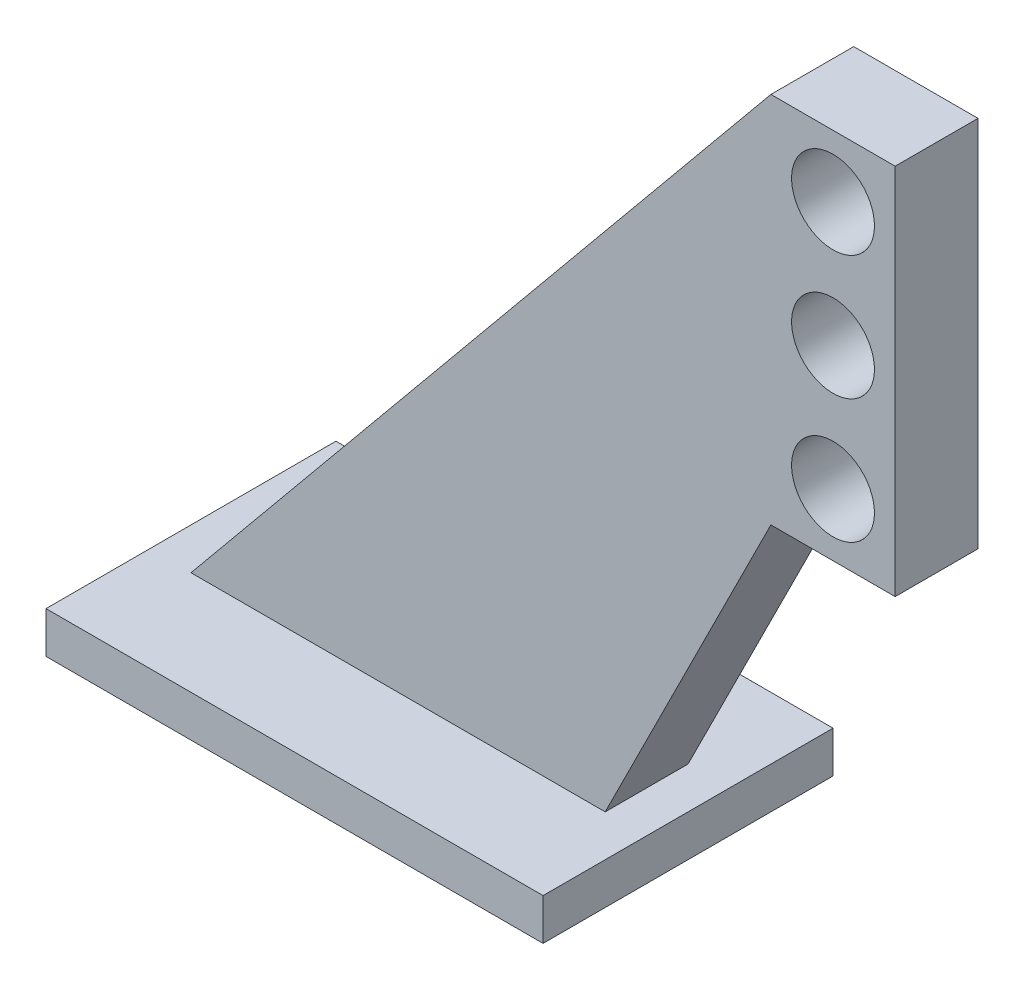
ISO-10303-21;
HEADER;
FILE_DESCRIPTION(('STEP AP214'),'2;1');
FILE_NAME('part.step','',(''),(''),'','','');
FILE_SCHEMA(('AUTOMOTIVE_DESIGN { 1 0 10303 214 1 1 1 1 }'));
ENDSEC;
DATA;
#1=APPLICATION_CONTEXT('core data for automotive mechanical design processes');
#2=APPLICATION_PROTOCOL_DEFINITION('international standard','automotive_design',2000,#1);
#3=PRODUCT_CONTEXT('',#1,'mechanical');
#4=PRODUCT('Part','Part','',(#3));
#5=PRODUCT_RELATED_PRODUCT_CATEGORY('part','',(#4));
#6=PRODUCT_DEFINITION_FORMATION('','',#4);
#7=PRODUCT_DEFINITION_CONTEXT('part definition',#1,'design');
#8=PRODUCT_DEFINITION('design','',#6,#7);
#9=PRODUCT_DEFINITION_SHAPE('','',#8);
#10=(LENGTH_UNIT() NAMED_UNIT(*) SI_UNIT(.MILLI.,.METRE.));
#11=(NAMED_UNIT(*) PLANE_ANGLE_UNIT() SI_UNIT($,.RADIAN.));
#12=(NAMED_UNIT(*) SI_UNIT($,.STERADIAN.) SOLID_ANGLE_UNIT());
#13=UNCERTAINTY_MEASURE_WITH_UNIT(LENGTH_MEASURE(1.E-05),#10,'distance_accuracy_value','');
#14=(GEOMETRIC_REPRESENTATION_CONTEXT(3) GLOBAL_UNCERTAINTY_ASSIGNED_CONTEXT((#13)) GLOBAL_UNIT_ASSIGNED_CONTEXT((#10,
#11,#12)) REPRESENTATION_CONTEXT('',''));
#15=CARTESIAN_POINT('',(0.,0.,0.));
#16=DIRECTION('',(0.,0.,1.));
#17=DIRECTION('',(1.,0.,0.));
#18=AXIS2_PLACEMENT_3D('',#15,#16,#17);
#19=CARTESIAN_POINT('',(0.,0.,2.));
#20=DIRECTION('',(0.,0.,1.));
#21=DIRECTION('',(1.,0.,0.));
#22=AXIS2_PLACEMENT_3D('',#19,#20,#21);
#23=PLANE('',#22);
#24=CARTESIAN_POINT('',(15.5,15.5,2.));
#25=DIRECTION('',(0.,0.,1.));
#26=DIRECTION('',(1.,0.,0.));
#27=AXIS2_PLACEMENT_3D('',#24,#25,#26);
#28=CIRCLE('',#27,1.);
#29=CARTESIAN_POINT('',(16.5,15.5,2.));
#30=VERTEX_POINT('',#29);
#31=EDGE_CURVE('E240',#30,#30,#28,.T.);
#32=ORIENTED_EDGE('',*,*,#31,.F.);
#33=EDGE_LOOP('',(#32));
#34=FACE_BOUND('',#33,.T.);
#35=DIRECTION('',(-0.6357072528611,-0.77193023561705,0.));
#36=VECTOR('',#35,1.);
#37=CARTESIAN_POINT('',(14.,17.,2.));
#38=LINE('',#37,#36);
#39=CARTESIAN_POINT('',(14.,17.,2.));
#40=VERTEX_POINT('',#39);
#41=CARTESIAN_POINT('',(0.,0.,2.));
#42=VERTEX_POINT('',#41);
#43=EDGE_CURVE('E84',#40,#42,#38,.T.);
#44=ORIENTED_EDGE('',*,*,#43,.T.);
#45=DIRECTION('',(1.,0.,0.));
#46=VECTOR('',#45,1.);
#47=CARTESIAN_POINT('',(0.,0.,2.));
#48=LINE('',#47,#46);
#49=CARTESIAN_POINT('',(10.,0.,2.));
#50=VERTEX_POINT('',#49);
#51=EDGE_CURVE('E144',#42,#50,#48,.T.);
#52=ORIENTED_EDGE('',*,*,#51,.T.);
#53=DIRECTION('',(0.447213595499958,0.894427190999916,0.));
#54=VECTOR('',#53,1.);
#55=CARTESIAN_POINT('',(10.,0.,2.));
#56=LINE('',#55,#54);
#57=CARTESIAN_POINT('',(14.,8.,2.));
#58=VERTEX_POINT('',#57);
#59=EDGE_CURVE('E100',#50,#58,#56,.T.);
#60=ORIENTED_EDGE('',*,*,#59,.T.);
#61=DIRECTION('',(1.,0.,0.));
#62=VECTOR('',#61,1.);
#63=CARTESIAN_POINT('',(14.,8.,2.));
#64=LINE('',#63,#62);
#65=CARTESIAN_POINT('',(17.,8.,2.));
#66=VERTEX_POINT('',#65);
#67=EDGE_CURVE('E94',#58,#66,#64,.T.);
#68=ORIENTED_EDGE('',*,*,#67,.T.);
#69=DIRECTION('',(0.,1.,0.));
#70=VECTOR('',#69,1.);
#71=CARTESIAN_POINT('',(17.,8.,2.));
#72=LINE('',#71,#70);
#73=CARTESIAN_POINT('',(17.,17.,2.));
#74=VERTEX_POINT('',#73);
#75=EDGE_CURVE('E98',#66,#74,#72,.T.);
#76=ORIENTED_EDGE('',*,*,#75,.T.);
#77=DIRECTION('',(-1.,0.,0.));
#78=VECTOR('',#77,1.);
#79=CARTESIAN_POINT('',(17.,17.,2.));
#80=LINE('',#79,#78);
#81=EDGE_CURVE('E51',#74,#40,#80,.T.);
#82=ORIENTED_EDGE('',*,*,#81,.T.);
#83=EDGE_LOOP('',(#44,#52,#60,#68,#76,#82));
#84=FACE_BOUND('',#83,.T.);
#85=CARTESIAN_POINT('',(15.5,12.5,2.));
#86=DIRECTION('',(0.,0.,1.));
#87=DIRECTION('',(1.,0.,0.));
#88=AXIS2_PLACEMENT_3D('',#85,#86,#87);
#89=CIRCLE('',#88,1.);
#90=CARTESIAN_POINT('',(16.5,12.5,2.));
#91=VERTEX_POINT('',#90);
#92=EDGE_CURVE('E122',#91,#91,#89,.T.);
#93=ORIENTED_EDGE('',*,*,#92,.F.);
#94=EDGE_LOOP('',(#93));
#95=FACE_BOUND('',#94,.T.);
#96=CARTESIAN_POINT('',(15.5,9.49999999999999,2.));
#97=DIRECTION('',(0.,0.,1.));
#98=DIRECTION('',(1.,0.,0.));
#99=AXIS2_PLACEMENT_3D('',#96,#97,#98);
#100=CIRCLE('',#99,1.);
#101=CARTESIAN_POINT('',(16.5,9.49999999999999,2.));
#102=VERTEX_POINT('',#101);
#103=EDGE_CURVE('E230',#102,#102,#100,.T.);
#104=ORIENTED_EDGE('',*,*,#103,.F.);
#105=EDGE_LOOP('',(#104));
#106=FACE_BOUND('',#105,.T.);
#107=ADVANCED_FACE('F34',(#34,#84,#95,#106),#23,.T.);
#108=CARTESIAN_POINT('',(0.,0.,0.));
#109=DIRECTION('',(0.,0.,1.));
#110=DIRECTION('',(1.,0.,0.));
#111=AXIS2_PLACEMENT_3D('',#108,#109,#110);
#112=PLANE('',#111);
#113=DIRECTION('',(-0.6357072528611,-0.77193023561705,0.));
#114=VECTOR('',#113,1.);
#115=CARTESIAN_POINT('',(14.,17.,0.));
#116=LINE('',#115,#114);
#117=CARTESIAN_POINT('',(14.,17.,0.));
#118=VERTEX_POINT('',#117);
#119=CARTESIAN_POINT('',(0.,0.,0.));
#120=VERTEX_POINT('',#119);
#121=EDGE_CURVE('E118',#118,#120,#116,.T.);
#122=ORIENTED_EDGE('',*,*,#121,.F.);
#123=DIRECTION('',(-1.,0.,0.));
#124=VECTOR('',#123,1.);
#125=CARTESIAN_POINT('',(17.,17.,0.));
#126=LINE('',#125,#124);
#127=CARTESIAN_POINT('',(17.,17.,0.));
#128=VERTEX_POINT('',#127);
#129=EDGE_CURVE('E78',#128,#118,#126,.T.);
#130=ORIENTED_EDGE('',*,*,#129,.F.);
#131=DIRECTION('',(0.,1.,0.));
#132=VECTOR('',#131,1.);
#133=CARTESIAN_POINT('',(17.,8.,0.));
#134=LINE('',#133,#132);
#135=CARTESIAN_POINT('',(17.,8.,0.));
#136=VERTEX_POINT('',#135);
#137=EDGE_CURVE('E72',#136,#128,#134,.T.);
#138=ORIENTED_EDGE('',*,*,#137,.F.);
#139=DIRECTION('',(1.,0.,0.));
#140=VECTOR('',#139,1.);
#141=CARTESIAN_POINT('',(14.,8.,0.));
#142=LINE('',#141,#140);
#143=CARTESIAN_POINT('',(14.,8.,0.));
#144=VERTEX_POINT('',#143);
#145=EDGE_CURVE('E108',#144,#136,#142,.T.);
#146=ORIENTED_EDGE('',*,*,#145,.F.);
#147=DIRECTION('',(0.447213595499958,0.894427190999916,0.));
#148=VECTOR('',#147,1.);
#149=CARTESIAN_POINT('',(10.,0.,0.));
#150=LINE('',#149,#148);
#151=CARTESIAN_POINT('',(10.,0.,0.));
#152=VERTEX_POINT('',#151);
#153=EDGE_CURVE('E125',#152,#144,#150,.T.);
#154=ORIENTED_EDGE('',*,*,#153,.F.);
#155=DIRECTION('',(1.,0.,0.));
#156=VECTOR('',#155,1.);
#157=CARTESIAN_POINT('',(0.,0.,0.));
#158=LINE('',#157,#156);
#159=EDGE_CURVE('E121',#120,#152,#158,.T.);
#160=ORIENTED_EDGE('',*,*,#159,.F.);
#161=EDGE_LOOP('',(#122,#130,#138,#146,#154,#160));
#162=FACE_BOUND('',#161,.T.);
#163=CARTESIAN_POINT('',(15.5,12.5,0.));
#164=DIRECTION('',(0.,0.,1.));
#165=DIRECTION('',(1.,0.,0.));
#166=AXIS2_PLACEMENT_3D('',#163,#164,#165);
#167=CIRCLE('',#166,1.);
#168=CARTESIAN_POINT('',(16.5,12.5,0.));
#169=VERTEX_POINT('',#168);
#170=EDGE_CURVE('E243',#169,#169,#167,.T.);
#171=ORIENTED_EDGE('',*,*,#170,.T.);
#172=EDGE_LOOP('',(#171));
#173=FACE_BOUND('',#172,.T.);
#174=CARTESIAN_POINT('',(15.5,15.5,0.));
#175=DIRECTION('',(0.,0.,1.));
#176=DIRECTION('',(1.,0.,0.));
#177=AXIS2_PLACEMENT_3D('',#174,#175,#176);
#178=CIRCLE('',#177,1.);
#179=CARTESIAN_POINT('',(16.5,15.5,0.));
#180=VERTEX_POINT('',#179);
#181=EDGE_CURVE('E238',#180,#180,#178,.T.);
#182=ORIENTED_EDGE('',*,*,#181,.T.);
#183=EDGE_LOOP('',(#182));
#184=FACE_BOUND('',#183,.T.);
#185=CARTESIAN_POINT('',(15.5,9.49999999999999,0.));
#186=DIRECTION('',(0.,0.,1.));
#187=DIRECTION('',(1.,0.,0.));
#188=AXIS2_PLACEMENT_3D('',#185,#186,#187);
#189=CIRCLE('',#188,1.);
#190=CARTESIAN_POINT('',(16.5,9.49999999999999,0.));
#191=VERTEX_POINT('',#190);
#192=EDGE_CURVE('E226',#191,#191,#189,.T.);
#193=ORIENTED_EDGE('',*,*,#192,.T.);
#194=EDGE_LOOP('',(#193));
#195=FACE_BOUND('',#194,.T.);
#196=ADVANCED_FACE('F141',(#162,#173,#184,#195),#112,.F.);
#197=CARTESIAN_POINT('',(14.,17.,2.));
#198=DIRECTION('',(0.77193023561705,-0.6357072528611,0.));
#199=DIRECTION('',(0.6357072528611,0.77193023561705,0.));
#200=AXIS2_PLACEMENT_3D('',#197,#198,#199);
#201=PLANE('',#200);
#202=ORIENTED_EDGE('',*,*,#121,.T.);
#203=DIRECTION('',(0.,0.,-1.));
#204=VECTOR('',#203,1.);
#205=CARTESIAN_POINT('',(0.,0.,2.));
#206=LINE('',#205,#204);
#207=EDGE_CURVE('E11',#42,#120,#206,.T.);
#208=ORIENTED_EDGE('',*,*,#207,.F.);
#209=ORIENTED_EDGE('',*,*,#43,.F.);
#210=DIRECTION('',(0.,0.,-1.));
#211=VECTOR('',#210,1.);
#212=CARTESIAN_POINT('',(14.,17.,2.));
#213=LINE('',#212,#211);
#214=EDGE_CURVE('E114',#40,#118,#213,.T.);
#215=ORIENTED_EDGE('',*,*,#214,.T.);
#216=EDGE_LOOP('',(#202,#208,#209,#215));
#217=FACE_BOUND('',#216,.T.);
#218=ADVANCED_FACE('F36',(#217),#201,.F.);
#219=CARTESIAN_POINT('',(10.,0.,2.));
#220=DIRECTION('',(-0.894427190999916,0.447213595499958,0.));
#221=DIRECTION('',(-0.447213595499958,-0.894427190999916,0.));
#222=AXIS2_PLACEMENT_3D('',#219,#220,#221);
#223=PLANE('',#222);
#224=ORIENTED_EDGE('',*,*,#153,.T.);
#225=DIRECTION('',(0.,0.,-1.));
#226=VECTOR('',#225,1.);
#227=CARTESIAN_POINT('',(14.,8.,2.));
#228=LINE('',#227,#226);
#229=EDGE_CURVE('E109',#58,#144,#228,.T.);
#230=ORIENTED_EDGE('',*,*,#229,.F.);
#231=ORIENTED_EDGE('',*,*,#59,.F.);
#232=DIRECTION('',(0.,0.,-1.));
#233=VECTOR('',#232,1.);
#234=CARTESIAN_POINT('',(10.,0.,2.));
#235=LINE('',#234,#233);
#236=EDGE_CURVE('E43',#50,#152,#235,.T.);
#237=ORIENTED_EDGE('',*,*,#236,.T.);
#238=EDGE_LOOP('',(#224,#230,#231,#237));
#239=FACE_BOUND('',#238,.T.);
#240=ADVANCED_FACE('F135',(#239),#223,.F.);
#241=CARTESIAN_POINT('',(14.,8.,2.));
#242=DIRECTION('',(0.,1.,0.));
#243=DIRECTION('',(0.,0.,1.));
#244=AXIS2_PLACEMENT_3D('',#241,#242,#243);
#245=PLANE('',#244);
#246=ORIENTED_EDGE('',*,*,#145,.T.);
#247=DIRECTION('',(0.,0.,-1.));
#248=VECTOR('',#247,1.);
#249=CARTESIAN_POINT('',(17.,8.,2.));
#250=LINE('',#249,#248);
#251=EDGE_CURVE('E105',#66,#136,#250,.T.);
#252=ORIENTED_EDGE('',*,*,#251,.F.);
#253=ORIENTED_EDGE('',*,*,#67,.F.);
#254=ORIENTED_EDGE('',*,*,#229,.T.);
#255=EDGE_LOOP('',(#246,#252,#253,#254));
#256=FACE_BOUND('',#255,.T.);
#257=ADVANCED_FACE('F106',(#256),#245,.F.);
#258=CARTESIAN_POINT('',(17.,8.,2.));
#259=DIRECTION('',(-1.,0.,0.));
#260=DIRECTION('',(0.,-1.,0.));
#261=AXIS2_PLACEMENT_3D('',#258,#259,#260);
#262=PLANE('',#261);
#263=ORIENTED_EDGE('',*,*,#137,.T.);
#264=DIRECTION('',(0.,0.,-1.));
#265=VECTOR('',#264,1.);
#266=CARTESIAN_POINT('',(17.,17.,2.));
#267=LINE('',#266,#265);
#268=EDGE_CURVE('E110',#74,#128,#267,.T.);
#269=ORIENTED_EDGE('',*,*,#268,.F.);
#270=ORIENTED_EDGE('',*,*,#75,.F.);
#271=ORIENTED_EDGE('',*,*,#251,.T.);
#272=EDGE_LOOP('',(#263,#269,#270,#271));
#273=FACE_BOUND('',#272,.T.);
#274=ADVANCED_FACE('F112',(#273),#262,.F.);
#275=CARTESIAN_POINT('',(17.,17.,2.));
#276=DIRECTION('',(0.,-1.,0.));
#277=DIRECTION('',(0.,0.,-1.));
#278=AXIS2_PLACEMENT_3D('',#275,#276,#277);
#279=PLANE('',#278);
#280=ORIENTED_EDGE('',*,*,#129,.T.);
#281=ORIENTED_EDGE('',*,*,#214,.F.);
#282=ORIENTED_EDGE('',*,*,#81,.F.);
#283=ORIENTED_EDGE('',*,*,#268,.T.);
#284=EDGE_LOOP('',(#280,#281,#282,#283));
#285=FACE_BOUND('',#284,.T.);
#286=ADVANCED_FACE('F147',(#285),#279,.F.);
#287=CARTESIAN_POINT('',(15.5,12.5,2.));
#288=DIRECTION('',(0.,0.,-1.));
#289=DIRECTION('',(-1.,0.,0.));
#290=AXIS2_PLACEMENT_3D('',#287,#288,#289);
#291=CYLINDRICAL_SURFACE('',#290,1.);
#292=ORIENTED_EDGE('',*,*,#92,.T.);
#293=EDGE_LOOP('',(#292));
#294=FACE_BOUND('',#293,.T.);
#295=ORIENTED_EDGE('',*,*,#170,.F.);
#296=EDGE_LOOP('',(#295));
#297=FACE_BOUND('',#296,.T.);
#298=ADVANCED_FACE('F149',(#294,#297),#291,.F.);
#299=CARTESIAN_POINT('',(15.5,15.5,2.));
#300=DIRECTION('',(0.,0.,-1.));
#301=DIRECTION('',(-1.,0.,0.));
#302=AXIS2_PLACEMENT_3D('',#299,#300,#301);
#303=CYLINDRICAL_SURFACE('',#302,1.);
#304=ORIENTED_EDGE('',*,*,#31,.T.);
#305=EDGE_LOOP('',(#304));
#306=FACE_BOUND('',#305,.T.);
#307=ORIENTED_EDGE('',*,*,#181,.F.);
#308=EDGE_LOOP('',(#307));
#309=FACE_BOUND('',#308,.T.);
#310=ADVANCED_FACE('F155',(#306,#309),#303,.F.);
#311=CARTESIAN_POINT('',(15.5,9.49999999999999,2.));
#312=DIRECTION('',(0.,0.,-1.));
#313=DIRECTION('',(-1.,0.,0.));
#314=AXIS2_PLACEMENT_3D('',#311,#312,#313);
#315=CYLINDRICAL_SURFACE('',#314,1.);
#316=ORIENTED_EDGE('',*,*,#103,.T.);
#317=EDGE_LOOP('',(#316));
#318=FACE_BOUND('',#317,.T.);
#319=ORIENTED_EDGE('',*,*,#192,.F.);
#320=EDGE_LOOP('',(#319));
#321=FACE_BOUND('',#320,.T.);
#322=ADVANCED_FACE('F170',(#318,#321),#315,.F.);
#323=CARTESIAN_POINT('',(0.,0.,0.));
#324=DIRECTION('',(0.,-1.,0.));
#325=DIRECTION('',(0.,0.,-1.));
#326=AXIS2_PLACEMENT_3D('',#323,#324,#325);
#327=PLANE('',#326);
#328=DIRECTION('',(0.,0.,-1.));
#329=VECTOR('',#328,1.);
#330=CARTESIAN_POINT('',(-1.,0.,-2.5));
#331=LINE('',#330,#329);
#332=CARTESIAN_POINT('',(-1.,0.,4.5));
#333=VERTEX_POINT('',#332);
#334=CARTESIAN_POINT('',(-1.,0.,-2.5));
#335=VERTEX_POINT('',#334);
#336=EDGE_CURVE('E224',#333,#335,#331,.T.);
#337=ORIENTED_EDGE('',*,*,#336,.F.);
#338=DIRECTION('',(-1.,0.,0.));
#339=VECTOR('',#338,1.);
#340=CARTESIAN_POINT('',(11.,0.,4.5));
#341=LINE('',#340,#339);
#342=CARTESIAN_POINT('',(11.,0.,4.5));
#343=VERTEX_POINT('',#342);
#344=EDGE_CURVE('E217',#343,#333,#341,.T.);
#345=ORIENTED_EDGE('',*,*,#344,.F.);
#346=DIRECTION('',(0.,0.,1.));
#347=VECTOR('',#346,1.);
#348=CARTESIAN_POINT('',(11.,0.,-2.5));
#349=LINE('',#348,#347);
#350=CARTESIAN_POINT('',(11.,0.,-2.5));
#351=VERTEX_POINT('',#350);
#352=EDGE_CURVE('E268',#351,#343,#349,.T.);
#353=ORIENTED_EDGE('',*,*,#352,.F.);
#354=DIRECTION('',(1.,0.,0.));
#355=VECTOR('',#354,1.);
#356=CARTESIAN_POINT('',(11.,0.,-2.5));
#357=LINE('',#356,#355);
#358=EDGE_CURVE('E271',#335,#351,#357,.T.);
#359=ORIENTED_EDGE('',*,*,#358,.F.);
#360=EDGE_LOOP('',(#337,#345,#353,#359));
#361=FACE_BOUND('',#360,.T.);
#362=ORIENTED_EDGE('',*,*,#207,.T.);
#363=ORIENTED_EDGE('',*,*,#159,.T.);
#364=ORIENTED_EDGE('',*,*,#236,.F.);
#365=ORIENTED_EDGE('',*,*,#51,.F.);
#366=EDGE_LOOP('',(#362,#363,#364,#365));
#367=FACE_BOUND('',#366,.T.);
#368=ADVANCED_FACE('F143',(#361,#367),#327,.F.);
#369=CARTESIAN_POINT('',(-1.,-1.,-2.5));
#370=DIRECTION('',(1.,0.,0.));
#371=DIRECTION('',(0.,0.,-1.));
#372=AXIS2_PLACEMENT_3D('',#369,#370,#371);
#373=PLANE('',#372);
#374=ORIENTED_EDGE('',*,*,#336,.T.);
#375=DIRECTION('',(0.,1.,0.));
#376=VECTOR('',#375,1.);
#377=CARTESIAN_POINT('',(-1.,-1.,-2.5));
#378=LINE('',#377,#376);
#379=CARTESIAN_POINT('',(-1.,-1.,-2.5));
#380=VERTEX_POINT('',#379);
#381=EDGE_CURVE('E221',#380,#335,#378,.T.);
#382=ORIENTED_EDGE('',*,*,#381,.F.);
#383=DIRECTION('',(0.,0.,-1.));
#384=VECTOR('',#383,1.);
#385=CARTESIAN_POINT('',(-1.,-1.,-2.5));
#386=LINE('',#385,#384);
#387=CARTESIAN_POINT('',(-1.,-1.,4.5));
#388=VERTEX_POINT('',#387);
#389=EDGE_CURVE('E204',#388,#380,#386,.T.);
#390=ORIENTED_EDGE('',*,*,#389,.F.);
#391=DIRECTION('',(0.,1.,0.));
#392=VECTOR('',#391,1.);
#393=CARTESIAN_POINT('',(-1.,-1.,4.5));
#394=LINE('',#393,#392);
#395=EDGE_CURVE('E264',#388,#333,#394,.T.);
#396=ORIENTED_EDGE('',*,*,#395,.T.);
#397=EDGE_LOOP('',(#374,#382,#390,#396));
#398=FACE_BOUND('',#397,.T.);
#399=ADVANCED_FACE('F175',(#398),#373,.F.);
#400=CARTESIAN_POINT('',(11.,-1.,-2.5));
#401=DIRECTION('',(0.,0.,1.));
#402=DIRECTION('',(1.,0.,0.));
#403=AXIS2_PLACEMENT_3D('',#400,#401,#402);
#404=PLANE('',#403);
#405=ORIENTED_EDGE('',*,*,#358,.T.);
#406=DIRECTION('',(0.,1.,0.));
#407=VECTOR('',#406,1.);
#408=CARTESIAN_POINT('',(11.,-1.,-2.5));
#409=LINE('',#408,#407);
#410=CARTESIAN_POINT('',(11.,-1.,-2.5));
#411=VERTEX_POINT('',#410);
#412=EDGE_CURVE('E227',#411,#351,#409,.T.);
#413=ORIENTED_EDGE('',*,*,#412,.F.);
#414=DIRECTION('',(1.,0.,0.));
#415=VECTOR('',#414,1.);
#416=CARTESIAN_POINT('',(11.,-1.,-2.5));
#417=LINE('',#416,#415);
#418=EDGE_CURVE('E209',#380,#411,#417,.T.);
#419=ORIENTED_EDGE('',*,*,#418,.F.);
#420=ORIENTED_EDGE('',*,*,#381,.T.);
#421=EDGE_LOOP('',(#405,#413,#419,#420));
#422=FACE_BOUND('',#421,.T.);
#423=ADVANCED_FACE('F178',(#422),#404,.F.);
#424=CARTESIAN_POINT('',(11.,-1.,-2.5));
#425=DIRECTION('',(-1.,0.,0.));
#426=DIRECTION('',(0.,0.,1.));
#427=AXIS2_PLACEMENT_3D('',#424,#425,#426);
#428=PLANE('',#427);
#429=ORIENTED_EDGE('',*,*,#352,.T.);
#430=DIRECTION('',(0.,1.,0.));
#431=VECTOR('',#430,1.);
#432=CARTESIAN_POINT('',(11.,-1.,4.5));
#433=LINE('',#432,#431);
#434=CARTESIAN_POINT('',(11.,-1.,4.5));
#435=VERTEX_POINT('',#434);
#436=EDGE_CURVE('E233',#435,#343,#433,.T.);
#437=ORIENTED_EDGE('',*,*,#436,.F.);
#438=DIRECTION('',(0.,0.,1.));
#439=VECTOR('',#438,1.);
#440=CARTESIAN_POINT('',(11.,-1.,-2.5));
#441=LINE('',#440,#439);
#442=EDGE_CURVE('E275',#411,#435,#441,.T.);
#443=ORIENTED_EDGE('',*,*,#442,.F.);
#444=ORIENTED_EDGE('',*,*,#412,.T.);
#445=EDGE_LOOP('',(#429,#437,#443,#444));
#446=FACE_BOUND('',#445,.T.);
#447=ADVANCED_FACE('F182',(#446),#428,.F.);
#448=CARTESIAN_POINT('',(11.,-1.,4.5));
#449=DIRECTION('',(0.,0.,-1.));
#450=DIRECTION('',(-1.,0.,0.));
#451=AXIS2_PLACEMENT_3D('',#448,#449,#450);
#452=PLANE('',#451);
#453=ORIENTED_EDGE('',*,*,#344,.T.);
#454=ORIENTED_EDGE('',*,*,#395,.F.);
#455=DIRECTION('',(-1.,0.,0.));
#456=VECTOR('',#455,1.);
#457=CARTESIAN_POINT('',(11.,-1.,4.5));
#458=LINE('',#457,#456);
#459=EDGE_CURVE('E212',#435,#388,#458,.T.);
#460=ORIENTED_EDGE('',*,*,#459,.F.);
#461=ORIENTED_EDGE('',*,*,#436,.T.);
#462=EDGE_LOOP('',(#453,#454,#460,#461));
#463=FACE_BOUND('',#462,.T.);
#464=ADVANCED_FACE('F186',(#463),#452,.F.);
#465=CARTESIAN_POINT('',(0.,-1.,0.));
#466=DIRECTION('',(0.,-1.,0.));
#467=DIRECTION('',(0.,0.,-1.));
#468=AXIS2_PLACEMENT_3D('',#465,#466,#467);
#469=PLANE('',#468);
#470=ORIENTED_EDGE('',*,*,#389,.T.);
#471=ORIENTED_EDGE('',*,*,#418,.T.);
#472=ORIENTED_EDGE('',*,*,#442,.T.);
#473=ORIENTED_EDGE('',*,*,#459,.T.);
#474=EDGE_LOOP('',(#470,#471,#472,#473));
#475=FACE_BOUND('',#474,.T.);
#476=ADVANCED_FACE('F190',(#475),#469,.T.);
#477=CLOSED_SHELL('',(#107,#196,#218,#240,#257,#274,#286,#298,#310,#322,#368,#399,#423,#447,
#464,#476));
#478=MANIFOLD_SOLID_BREP('B2',#477);
#479=ADVANCED_BREP_SHAPE_REPRESENTATION('',(#18,#478),#14);
#480=SHAPE_DEFINITION_REPRESENTATION(#9,#479);
ENDSEC;
END-ISO-10303-21;
